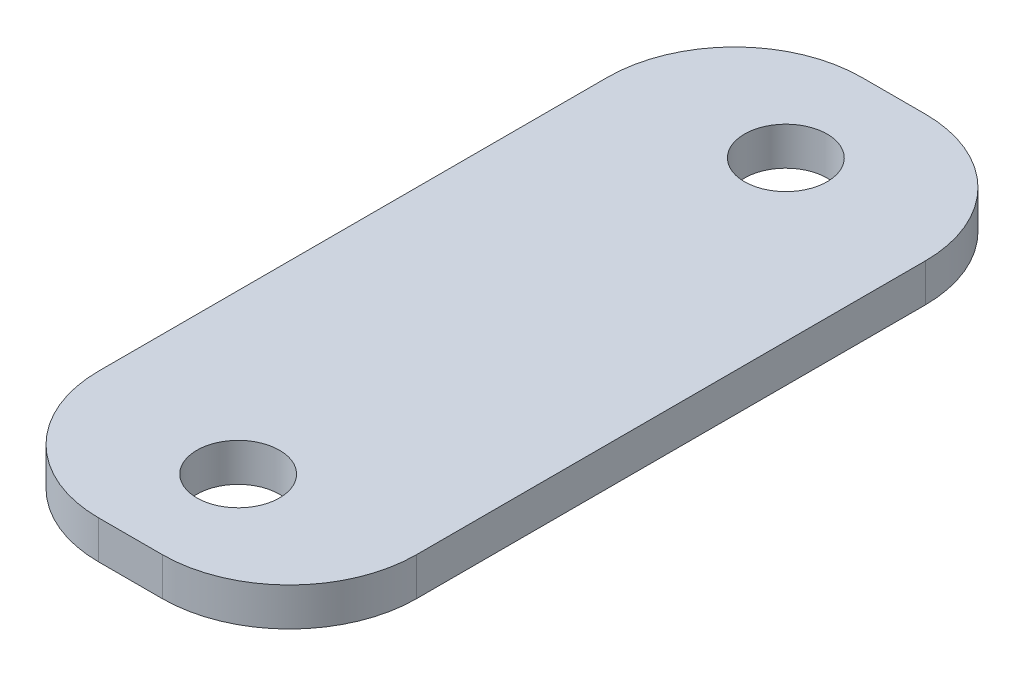
ISO-10303-21;
HEADER;
FILE_DESCRIPTION(('STEP AP214'),'2;1');
FILE_NAME('part.step','',(''),(''),'','','');
FILE_SCHEMA(('AUTOMOTIVE_DESIGN { 1 0 10303 214 1 1 1 1 }'));
ENDSEC;
DATA;
#1=APPLICATION_CONTEXT('core data for automotive mechanical design processes');
#2=APPLICATION_PROTOCOL_DEFINITION('international standard','automotive_design',2000,#1);
#3=PRODUCT_CONTEXT('',#1,'mechanical');
#4=PRODUCT('Part','Part','',(#3));
#5=PRODUCT_RELATED_PRODUCT_CATEGORY('part','',(#4));
#6=PRODUCT_DEFINITION_FORMATION('','',#4);
#7=PRODUCT_DEFINITION_CONTEXT('part definition',#1,'design');
#8=PRODUCT_DEFINITION('design','',#6,#7);
#9=PRODUCT_DEFINITION_SHAPE('','',#8);
#10=(LENGTH_UNIT() NAMED_UNIT(*) SI_UNIT(.MILLI.,.METRE.));
#11=(NAMED_UNIT(*) PLANE_ANGLE_UNIT() SI_UNIT($,.RADIAN.));
#12=(NAMED_UNIT(*) SI_UNIT($,.STERADIAN.) SOLID_ANGLE_UNIT());
#13=UNCERTAINTY_MEASURE_WITH_UNIT(LENGTH_MEASURE(1.E-05),#10,'distance_accuracy_value','');
#14=(GEOMETRIC_REPRESENTATION_CONTEXT(3) GLOBAL_UNCERTAINTY_ASSIGNED_CONTEXT((#13)) GLOBAL_UNIT_ASSIGNED_CONTEXT((#10,
#11,#12)) REPRESENTATION_CONTEXT('',''));
#15=CARTESIAN_POINT('',(0.,0.,0.));
#16=DIRECTION('',(0.,0.,1.));
#17=DIRECTION('',(1.,0.,0.));
#18=AXIS2_PLACEMENT_3D('',#15,#16,#17);
#19=CARTESIAN_POINT('',(0.,3.,0.));
#20=DIRECTION('',(0.,1.,0.));
#21=DIRECTION('',(0.,0.,1.));
#22=AXIS2_PLACEMENT_3D('',#19,#20,#21);
#23=PLANE('',#22);
#24=CARTESIAN_POINT('',(0.,3.,-21.530596514783));
#25=DIRECTION('',(0.,1.,0.));
#26=DIRECTION('',(0.,0.,1.));
#27=AXIS2_PLACEMENT_3D('',#24,#25,#26);
#28=CIRCLE('',#27,3.25);
#29=CARTESIAN_POINT('',(0.,3.,-18.280596514783));
#30=VERTEX_POINT('',#29);
#31=EDGE_CURVE('E148',#30,#30,#28,.T.);
#32=ORIENTED_EDGE('',*,*,#31,.F.);
#33=EDGE_LOOP('',(#32));
#34=FACE_BOUND('',#33,.T.);
#35=DIRECTION('',(0.,0.,-1.));
#36=VECTOR('',#35,1.);
#37=CARTESIAN_POINT('',(12.5,3.,-30.));
#38=LINE('',#37,#36);
#39=CARTESIAN_POINT('',(12.5,3.,20.));
#40=VERTEX_POINT('',#39);
#41=CARTESIAN_POINT('',(12.5,3.,-20.));
#42=VERTEX_POINT('',#41);
#43=EDGE_CURVE('E154',#40,#42,#38,.T.);
#44=ORIENTED_EDGE('',*,*,#43,.T.);
#45=CARTESIAN_POINT('',(2.50000000000001,3.,-20.));
#46=DIRECTION('',(0.,1.,0.));
#47=DIRECTION('',(0.,0.,1.));
#48=AXIS2_PLACEMENT_3D('',#45,#46,#47);
#49=CIRCLE('',#48,10.);
#50=CARTESIAN_POINT('',(2.50000000000001,3.,-30.));
#51=VERTEX_POINT('',#50);
#52=EDGE_CURVE('E178',#42,#51,#49,.T.);
#53=ORIENTED_EDGE('',*,*,#52,.T.);
#54=DIRECTION('',(-1.,0.,0.));
#55=VECTOR('',#54,1.);
#56=CARTESIAN_POINT('',(-12.5,3.,-30.));
#57=LINE('',#56,#55);
#58=CARTESIAN_POINT('',(-2.50000000000001,3.,-30.));
#59=VERTEX_POINT('',#58);
#60=EDGE_CURVE('E131',#51,#59,#57,.T.);
#61=ORIENTED_EDGE('',*,*,#60,.T.);
#62=CARTESIAN_POINT('',(-2.50000000000001,3.,-20.));
#63=DIRECTION('',(0.,1.,0.));
#64=DIRECTION('',(0.,0.,1.));
#65=AXIS2_PLACEMENT_3D('',#62,#63,#64);
#66=CIRCLE('',#65,10.);
#67=CARTESIAN_POINT('',(-12.5,3.,-20.));
#68=VERTEX_POINT('',#67);
#69=EDGE_CURVE('E175',#59,#68,#66,.T.);
#70=ORIENTED_EDGE('',*,*,#69,.T.);
#71=DIRECTION('',(0.,0.,1.));
#72=VECTOR('',#71,1.);
#73=CARTESIAN_POINT('',(-12.5,3.,-30.));
#74=LINE('',#73,#72);
#75=CARTESIAN_POINT('',(-12.5,3.,20.));
#76=VERTEX_POINT('',#75);
#77=EDGE_CURVE('E190',#68,#76,#74,.T.);
#78=ORIENTED_EDGE('',*,*,#77,.T.);
#79=CARTESIAN_POINT('',(-2.50000000000001,3.,20.));
#80=DIRECTION('',(0.,1.,0.));
#81=DIRECTION('',(0.,0.,1.));
#82=AXIS2_PLACEMENT_3D('',#79,#80,#81);
#83=CIRCLE('',#82,10.);
#84=CARTESIAN_POINT('',(-2.50000000000001,3.,30.));
#85=VERTEX_POINT('',#84);
#86=EDGE_CURVE('E65',#76,#85,#83,.T.);
#87=ORIENTED_EDGE('',*,*,#86,.T.);
#88=DIRECTION('',(1.,0.,0.));
#89=VECTOR('',#88,1.);
#90=CARTESIAN_POINT('',(-12.5,3.,30.));
#91=LINE('',#90,#89);
#92=CARTESIAN_POINT('',(2.49999999999999,3.,30.));
#93=VERTEX_POINT('',#92);
#94=EDGE_CURVE('E156',#85,#93,#91,.T.);
#95=ORIENTED_EDGE('',*,*,#94,.T.);
#96=CARTESIAN_POINT('',(2.5,3.,20.));
#97=DIRECTION('',(0.,1.,0.));
#98=DIRECTION('',(0.,0.,1.));
#99=AXIS2_PLACEMENT_3D('',#96,#97,#98);
#100=CIRCLE('',#99,10.);
#101=EDGE_CURVE('E170',#93,#40,#100,.T.);
#102=ORIENTED_EDGE('',*,*,#101,.T.);
#103=EDGE_LOOP('',(#44,#53,#61,#70,#78,#87,#95,#102));
#104=FACE_BOUND('',#103,.T.);
#105=CARTESIAN_POINT('',(0.,3.,21.530596514783));
#106=DIRECTION('',(0.,1.,0.));
#107=DIRECTION('',(0.,0.,-1.));
#108=AXIS2_PLACEMENT_3D('',#105,#106,#107);
#109=CIRCLE('',#108,3.25);
#110=CARTESIAN_POINT('',(0.,3.,18.280596514783));
#111=VERTEX_POINT('',#110);
#112=EDGE_CURVE('E203',#111,#111,#109,.T.);
#113=ORIENTED_EDGE('',*,*,#112,.F.);
#114=EDGE_LOOP('',(#113));
#115=FACE_BOUND('',#114,.T.);
#116=ADVANCED_FACE('F43',(#34,#104,#115),#23,.T.);
#117=CARTESIAN_POINT('',(0.,0.,0.));
#118=DIRECTION('',(0.,1.,0.));
#119=DIRECTION('',(0.,0.,1.));
#120=AXIS2_PLACEMENT_3D('',#117,#118,#119);
#121=PLANE('',#120);
#122=DIRECTION('',(-1.,0.,0.));
#123=VECTOR('',#122,1.);
#124=CARTESIAN_POINT('',(-12.5,0.,-30.));
#125=LINE('',#124,#123);
#126=CARTESIAN_POINT('',(2.50000000000001,0.,-30.));
#127=VERTEX_POINT('',#126);
#128=CARTESIAN_POINT('',(-2.50000000000001,0.,-30.));
#129=VERTEX_POINT('',#128);
#130=EDGE_CURVE('E128',#127,#129,#125,.T.);
#131=ORIENTED_EDGE('',*,*,#130,.F.);
#132=CARTESIAN_POINT('',(2.50000000000001,0.,-20.));
#133=DIRECTION('',(0.,1.,0.));
#134=DIRECTION('',(0.,0.,1.));
#135=AXIS2_PLACEMENT_3D('',#132,#133,#134);
#136=CIRCLE('',#135,10.);
#137=CARTESIAN_POINT('',(12.5,0.,-20.));
#138=VERTEX_POINT('',#137);
#139=EDGE_CURVE('E110',#127,#138,#136,.F.);
#140=ORIENTED_EDGE('',*,*,#139,.T.);
#141=DIRECTION('',(0.,0.,-1.));
#142=VECTOR('',#141,1.);
#143=CARTESIAN_POINT('',(12.5,0.,-30.));
#144=LINE('',#143,#142);
#145=CARTESIAN_POINT('',(12.5,0.,20.));
#146=VERTEX_POINT('',#145);
#147=EDGE_CURVE('E141',#146,#138,#144,.T.);
#148=ORIENTED_EDGE('',*,*,#147,.F.);
#149=CARTESIAN_POINT('',(2.5,0.,20.));
#150=DIRECTION('',(0.,1.,0.));
#151=DIRECTION('',(0.,0.,1.));
#152=AXIS2_PLACEMENT_3D('',#149,#150,#151);
#153=CIRCLE('',#152,10.);
#154=CARTESIAN_POINT('',(2.49999999999999,0.,30.));
#155=VERTEX_POINT('',#154);
#156=EDGE_CURVE('E133',#146,#155,#153,.F.);
#157=ORIENTED_EDGE('',*,*,#156,.T.);
#158=DIRECTION('',(1.,0.,0.));
#159=VECTOR('',#158,1.);
#160=CARTESIAN_POINT('',(-12.5,0.,30.));
#161=LINE('',#160,#159);
#162=CARTESIAN_POINT('',(-2.50000000000001,0.,30.));
#163=VERTEX_POINT('',#162);
#164=EDGE_CURVE('E146',#163,#155,#161,.T.);
#165=ORIENTED_EDGE('',*,*,#164,.F.);
#166=CARTESIAN_POINT('',(-2.50000000000001,0.,20.));
#167=DIRECTION('',(0.,1.,0.));
#168=DIRECTION('',(0.,0.,1.));
#169=AXIS2_PLACEMENT_3D('',#166,#167,#168);
#170=CIRCLE('',#169,10.);
#171=CARTESIAN_POINT('',(-12.5,0.,20.));
#172=VERTEX_POINT('',#171);
#173=EDGE_CURVE('E160',#163,#172,#170,.F.);
#174=ORIENTED_EDGE('',*,*,#173,.T.);
#175=DIRECTION('',(0.,0.,1.));
#176=VECTOR('',#175,1.);
#177=CARTESIAN_POINT('',(-12.5,0.,-30.));
#178=LINE('',#177,#176);
#179=CARTESIAN_POINT('',(-12.5,0.,-20.));
#180=VERTEX_POINT('',#179);
#181=EDGE_CURVE('E140',#180,#172,#178,.T.);
#182=ORIENTED_EDGE('',*,*,#181,.F.);
#183=CARTESIAN_POINT('',(-2.50000000000001,0.,-20.));
#184=DIRECTION('',(0.,1.,0.));
#185=DIRECTION('',(0.,0.,1.));
#186=AXIS2_PLACEMENT_3D('',#183,#184,#185);
#187=CIRCLE('',#186,10.);
#188=EDGE_CURVE('E122',#180,#129,#187,.F.);
#189=ORIENTED_EDGE('',*,*,#188,.T.);
#190=EDGE_LOOP('',(#131,#140,#148,#157,#165,#174,#182,#189));
#191=FACE_BOUND('',#190,.T.);
#192=CARTESIAN_POINT('',(0.,0.,-21.530596514783));
#193=DIRECTION('',(0.,1.,0.));
#194=DIRECTION('',(0.,0.,1.));
#195=AXIS2_PLACEMENT_3D('',#192,#193,#194);
#196=CIRCLE('',#195,3.25);
#197=CARTESIAN_POINT('',(0.,0.,-18.280596514783));
#198=VERTEX_POINT('',#197);
#199=EDGE_CURVE('E199',#198,#198,#196,.T.);
#200=ORIENTED_EDGE('',*,*,#199,.T.);
#201=EDGE_LOOP('',(#200));
#202=FACE_BOUND('',#201,.T.);
#203=CARTESIAN_POINT('',(0.,0.,21.530596514783));
#204=DIRECTION('',(0.,1.,0.));
#205=DIRECTION('',(0.,0.,-1.));
#206=AXIS2_PLACEMENT_3D('',#203,#204,#205);
#207=CIRCLE('',#206,3.25);
#208=CARTESIAN_POINT('',(0.,0.,18.280596514783));
#209=VERTEX_POINT('',#208);
#210=EDGE_CURVE('E207',#209,#209,#207,.T.);
#211=ORIENTED_EDGE('',*,*,#210,.T.);
#212=EDGE_LOOP('',(#211));
#213=FACE_BOUND('',#212,.T.);
#214=ADVANCED_FACE('F136',(#191,#202,#213),#121,.F.);
#215=CARTESIAN_POINT('',(12.5,3.,-30.));
#216=DIRECTION('',(-1.,0.,0.));
#217=DIRECTION('',(0.,0.,1.));
#218=AXIS2_PLACEMENT_3D('',#215,#216,#217);
#219=PLANE('',#218);
#220=ORIENTED_EDGE('',*,*,#147,.T.);
#221=DIRECTION('',(0.,-1.,0.));
#222=VECTOR('',#221,1.);
#223=CARTESIAN_POINT('',(12.5,3.,-20.));
#224=LINE('',#223,#222);
#225=EDGE_CURVE('E115',#138,#42,#224,.F.);
#226=ORIENTED_EDGE('',*,*,#225,.T.);
#227=ORIENTED_EDGE('',*,*,#43,.F.);
#228=DIRECTION('',(0.,-1.,0.));
#229=VECTOR('',#228,1.);
#230=CARTESIAN_POINT('',(12.5,3.,20.));
#231=LINE('',#230,#229);
#232=EDGE_CURVE('E121',#40,#146,#231,.T.);
#233=ORIENTED_EDGE('',*,*,#232,.T.);
#234=EDGE_LOOP('',(#220,#226,#227,#233));
#235=FACE_BOUND('',#234,.T.);
#236=ADVANCED_FACE('F224',(#235),#219,.F.);
#237=CARTESIAN_POINT('',(-12.5,3.,-30.));
#238=DIRECTION('',(0.,0.,1.));
#239=DIRECTION('',(1.,0.,0.));
#240=AXIS2_PLACEMENT_3D('',#237,#238,#239);
#241=PLANE('',#240);
#242=ORIENTED_EDGE('',*,*,#60,.F.);
#243=DIRECTION('',(0.,-1.,0.));
#244=VECTOR('',#243,1.);
#245=CARTESIAN_POINT('',(2.50000000000001,3.,-30.));
#246=LINE('',#245,#244);
#247=EDGE_CURVE('E114',#51,#127,#246,.T.);
#248=ORIENTED_EDGE('',*,*,#247,.T.);
#249=ORIENTED_EDGE('',*,*,#130,.T.);
#250=DIRECTION('',(0.,-1.,0.));
#251=VECTOR('',#250,1.);
#252=CARTESIAN_POINT('',(-2.50000000000001,3.,-30.));
#253=LINE('',#252,#251);
#254=EDGE_CURVE('E134',#129,#59,#253,.F.);
#255=ORIENTED_EDGE('',*,*,#254,.T.);
#256=EDGE_LOOP('',(#242,#248,#249,#255));
#257=FACE_BOUND('',#256,.T.);
#258=ADVANCED_FACE('F127',(#257),#241,.F.);
#259=CARTESIAN_POINT('',(-12.5,3.,-30.));
#260=DIRECTION('',(1.,0.,0.));
#261=DIRECTION('',(0.,0.,-1.));
#262=AXIS2_PLACEMENT_3D('',#259,#260,#261);
#263=PLANE('',#262);
#264=ORIENTED_EDGE('',*,*,#77,.F.);
#265=DIRECTION('',(0.,-1.,0.));
#266=VECTOR('',#265,1.);
#267=CARTESIAN_POINT('',(-12.5,3.,-20.));
#268=LINE('',#267,#266);
#269=EDGE_CURVE('E184',#68,#180,#268,.T.);
#270=ORIENTED_EDGE('',*,*,#269,.T.);
#271=ORIENTED_EDGE('',*,*,#181,.T.);
#272=DIRECTION('',(0.,-1.,0.));
#273=VECTOR('',#272,1.);
#274=CARTESIAN_POINT('',(-12.5,3.,20.));
#275=LINE('',#274,#273);
#276=EDGE_CURVE('E181',#172,#76,#275,.F.);
#277=ORIENTED_EDGE('',*,*,#276,.T.);
#278=EDGE_LOOP('',(#264,#270,#271,#277));
#279=FACE_BOUND('',#278,.T.);
#280=ADVANCED_FACE('F234',(#279),#263,.F.);
#281=CARTESIAN_POINT('',(-12.5,3.,30.));
#282=DIRECTION('',(0.,0.,-1.));
#283=DIRECTION('',(-1.,0.,0.));
#284=AXIS2_PLACEMENT_3D('',#281,#282,#283);
#285=PLANE('',#284);
#286=ORIENTED_EDGE('',*,*,#94,.F.);
#287=DIRECTION('',(0.,-1.,0.));
#288=VECTOR('',#287,1.);
#289=CARTESIAN_POINT('',(-2.50000000000001,3.,30.));
#290=LINE('',#289,#288);
#291=EDGE_CURVE('E11',#85,#163,#290,.T.);
#292=ORIENTED_EDGE('',*,*,#291,.T.);
#293=ORIENTED_EDGE('',*,*,#164,.T.);
#294=DIRECTION('',(0.,-1.,0.));
#295=VECTOR('',#294,1.);
#296=CARTESIAN_POINT('',(2.49999999999999,3.,30.));
#297=LINE('',#296,#295);
#298=EDGE_CURVE('E52',#155,#93,#297,.F.);
#299=ORIENTED_EDGE('',*,*,#298,.T.);
#300=EDGE_LOOP('',(#286,#292,#293,#299));
#301=FACE_BOUND('',#300,.T.);
#302=ADVANCED_FACE('F231',(#301),#285,.F.);
#303=CARTESIAN_POINT('',(0.,3.,-21.530596514783));
#304=DIRECTION('',(0.,-1.,0.));
#305=DIRECTION('',(0.,0.,-1.));
#306=AXIS2_PLACEMENT_3D('',#303,#304,#305);
#307=CYLINDRICAL_SURFACE('',#306,3.25);
#308=ORIENTED_EDGE('',*,*,#31,.T.);
#309=EDGE_LOOP('',(#308));
#310=FACE_BOUND('',#309,.T.);
#311=ORIENTED_EDGE('',*,*,#199,.F.);
#312=EDGE_LOOP('',(#311));
#313=FACE_BOUND('',#312,.T.);
#314=ADVANCED_FACE('F228',(#310,#313),#307,.F.);
#315=CARTESIAN_POINT('',(0.,3.,21.530596514783));
#316=DIRECTION('',(0.,-1.,0.));
#317=DIRECTION('',(0.,0.,-1.));
#318=AXIS2_PLACEMENT_3D('',#315,#316,#317);
#319=CYLINDRICAL_SURFACE('',#318,3.25);
#320=ORIENTED_EDGE('',*,*,#112,.T.);
#321=EDGE_LOOP('',(#320));
#322=FACE_BOUND('',#321,.T.);
#323=ORIENTED_EDGE('',*,*,#210,.F.);
#324=EDGE_LOOP('',(#323));
#325=FACE_BOUND('',#324,.T.);
#326=ADVANCED_FACE('F215',(#322,#325),#319,.F.);
#327=CARTESIAN_POINT('',(2.50000000000001,3.,-20.));
#328=DIRECTION('',(0.,-1.,0.));
#329=DIRECTION('',(0.,0.,-1.));
#330=AXIS2_PLACEMENT_3D('',#327,#328,#329);
#331=CYLINDRICAL_SURFACE('',#330,10.);
#332=ORIENTED_EDGE('',*,*,#52,.F.);
#333=ORIENTED_EDGE('',*,*,#225,.F.);
#334=ORIENTED_EDGE('',*,*,#139,.F.);
#335=ORIENTED_EDGE('',*,*,#247,.F.);
#336=EDGE_LOOP('',(#332,#333,#334,#335));
#337=FACE_BOUND('',#336,.T.);
#338=ADVANCED_FACE('F113',(#337),#331,.T.);
#339=CARTESIAN_POINT('',(-2.50000000000001,3.,-20.));
#340=DIRECTION('',(0.,-1.,0.));
#341=DIRECTION('',(0.,0.,-1.));
#342=AXIS2_PLACEMENT_3D('',#339,#340,#341);
#343=CYLINDRICAL_SURFACE('',#342,10.);
#344=ORIENTED_EDGE('',*,*,#69,.F.);
#345=ORIENTED_EDGE('',*,*,#254,.F.);
#346=ORIENTED_EDGE('',*,*,#188,.F.);
#347=ORIENTED_EDGE('',*,*,#269,.F.);
#348=EDGE_LOOP('',(#344,#345,#346,#347));
#349=FACE_BOUND('',#348,.T.);
#350=ADVANCED_FACE('F245',(#349),#343,.T.);
#351=CARTESIAN_POINT('',(-2.50000000000001,3.,20.));
#352=DIRECTION('',(0.,-1.,0.));
#353=DIRECTION('',(0.,0.,-1.));
#354=AXIS2_PLACEMENT_3D('',#351,#352,#353);
#355=CYLINDRICAL_SURFACE('',#354,10.);
#356=ORIENTED_EDGE('',*,*,#86,.F.);
#357=ORIENTED_EDGE('',*,*,#276,.F.);
#358=ORIENTED_EDGE('',*,*,#173,.F.);
#359=ORIENTED_EDGE('',*,*,#291,.F.);
#360=EDGE_LOOP('',(#356,#357,#358,#359));
#361=FACE_BOUND('',#360,.T.);
#362=ADVANCED_FACE('F247',(#361),#355,.T.);
#363=CARTESIAN_POINT('',(2.5,3.,20.));
#364=DIRECTION('',(0.,-1.,0.));
#365=DIRECTION('',(0.,0.,-1.));
#366=AXIS2_PLACEMENT_3D('',#363,#364,#365);
#367=CYLINDRICAL_SURFACE('',#366,10.);
#368=ORIENTED_EDGE('',*,*,#101,.F.);
#369=ORIENTED_EDGE('',*,*,#298,.F.);
#370=ORIENTED_EDGE('',*,*,#156,.F.);
#371=ORIENTED_EDGE('',*,*,#232,.F.);
#372=EDGE_LOOP('',(#368,#369,#370,#371));
#373=FACE_BOUND('',#372,.T.);
#374=ADVANCED_FACE('F45',(#373),#367,.T.);
#375=CLOSED_SHELL('',(#116,#214,#236,#258,#280,#302,#314,#326,#338,#350,#362,#374));
#376=MANIFOLD_SOLID_BREP('B2',#375);
#377=ADVANCED_BREP_SHAPE_REPRESENTATION('',(#18,#376),#14);
#378=SHAPE_DEFINITION_REPRESENTATION(#9,#377);
ENDSEC;
END-ISO-10303-21;
